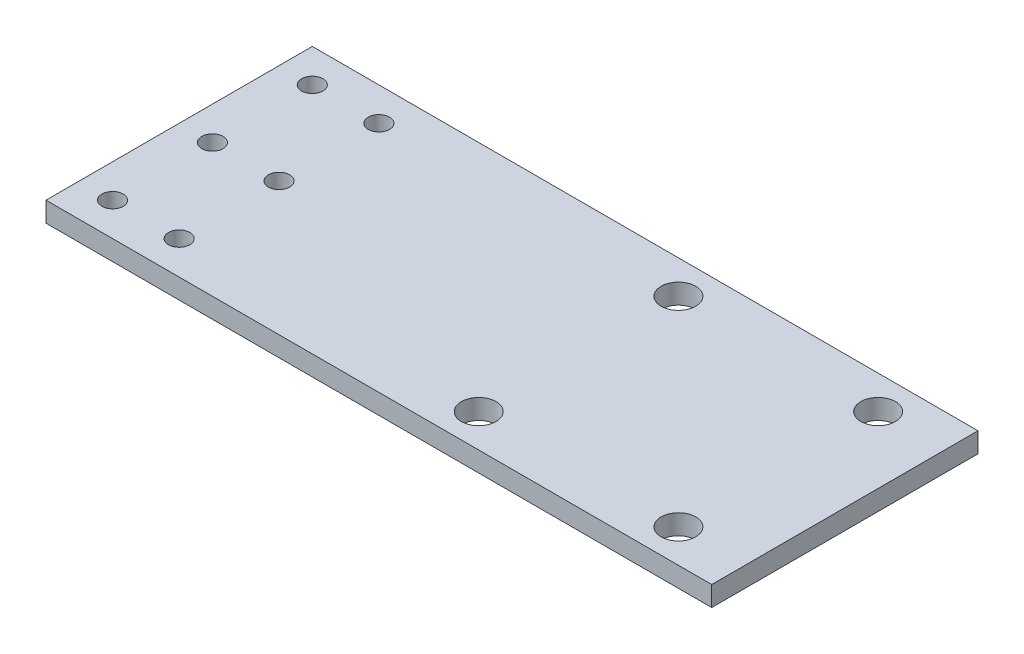
ISO-10303-21;
HEADER;
FILE_DESCRIPTION(('STEP AP214'),'2;1');
FILE_NAME('part.step','',(''),(''),'','','');
FILE_SCHEMA(('AUTOMOTIVE_DESIGN { 1 0 10303 214 1 1 1 1 }'));
ENDSEC;
DATA;
#1=APPLICATION_CONTEXT('core data for automotive mechanical design processes');
#2=APPLICATION_PROTOCOL_DEFINITION('international standard','automotive_design',2000,#1);
#3=PRODUCT_CONTEXT('',#1,'mechanical');
#4=PRODUCT('Part','Part','',(#3));
#5=PRODUCT_RELATED_PRODUCT_CATEGORY('part','',(#4));
#6=PRODUCT_DEFINITION_FORMATION('','',#4);
#7=PRODUCT_DEFINITION_CONTEXT('part definition',#1,'design');
#8=PRODUCT_DEFINITION('design','',#6,#7);
#9=PRODUCT_DEFINITION_SHAPE('','',#8);
#10=(LENGTH_UNIT() NAMED_UNIT(*) SI_UNIT(.MILLI.,.METRE.));
#11=(NAMED_UNIT(*) PLANE_ANGLE_UNIT() SI_UNIT($,.RADIAN.));
#12=(NAMED_UNIT(*) SI_UNIT($,.STERADIAN.) SOLID_ANGLE_UNIT());
#13=UNCERTAINTY_MEASURE_WITH_UNIT(LENGTH_MEASURE(1.E-05),#10,'distance_accuracy_value','');
#14=(GEOMETRIC_REPRESENTATION_CONTEXT(3) GLOBAL_UNCERTAINTY_ASSIGNED_CONTEXT((#13)) GLOBAL_UNIT_ASSIGNED_CONTEXT((#10,
#11,#12)) REPRESENTATION_CONTEXT('',''));
#15=CARTESIAN_POINT('',(0.,0.,0.));
#16=DIRECTION('',(0.,0.,1.));
#17=DIRECTION('',(1.,0.,0.));
#18=AXIS2_PLACEMENT_3D('',#15,#16,#17);
#19=CARTESIAN_POINT('',(0.,3.,0.));
#20=DIRECTION('',(0.,1.,0.));
#21=DIRECTION('',(0.,0.,1.));
#22=AXIS2_PLACEMENT_3D('',#19,#20,#21);
#23=PLANE('',#22);
#24=CARTESIAN_POINT('',(90.,3.,5.));
#25=DIRECTION('',(0.,1.,0.));
#26=DIRECTION('',(0.,0.,-1.));
#27=AXIS2_PLACEMENT_3D('',#24,#25,#26);
#28=CIRCLE('',#27,2.59999999999999);
#29=CARTESIAN_POINT('',(90.,3.,2.40000000000001));
#30=VERTEX_POINT('',#29);
#31=EDGE_CURVE('E165',#30,#30,#28,.T.);
#32=ORIENTED_EDGE('',*,*,#31,.F.);
#33=EDGE_LOOP('',(#32));
#34=FACE_BOUND('',#33,.T.);
#35=CARTESIAN_POINT('',(90.,3.,35.));
#36=DIRECTION('',(0.,1.,0.));
#37=DIRECTION('',(0.,0.,1.));
#38=AXIS2_PLACEMENT_3D('',#35,#36,#37);
#39=CIRCLE('',#38,2.59999999999999);
#40=CARTESIAN_POINT('',(90.,3.,37.6));
#41=VERTEX_POINT('',#40);
#42=EDGE_CURVE('E171',#41,#41,#39,.T.);
#43=ORIENTED_EDGE('',*,*,#42,.F.);
#44=EDGE_LOOP('',(#43));
#45=FACE_BOUND('',#44,.T.);
#46=CARTESIAN_POINT('',(60.,3.,35.));
#47=DIRECTION('',(0.,1.,0.));
#48=DIRECTION('',(0.,0.,-1.));
#49=AXIS2_PLACEMENT_3D('',#46,#47,#48);
#50=CIRCLE('',#49,2.59999999999999);
#51=CARTESIAN_POINT('',(60.,3.,32.4));
#52=VERTEX_POINT('',#51);
#53=EDGE_CURVE('E159',#52,#52,#50,.T.);
#54=ORIENTED_EDGE('',*,*,#53,.F.);
#55=EDGE_LOOP('',(#54));
#56=FACE_BOUND('',#55,.T.);
#57=CARTESIAN_POINT('',(60.,3.,5.));
#58=DIRECTION('',(0.,1.,0.));
#59=DIRECTION('',(0.,0.,1.));
#60=AXIS2_PLACEMENT_3D('',#57,#58,#59);
#61=CIRCLE('',#60,2.59999999999999);
#62=CARTESIAN_POINT('',(60.,3.,7.59999999999999));
#63=VERTEX_POINT('',#62);
#64=EDGE_CURVE('E156',#63,#63,#61,.T.);
#65=ORIENTED_EDGE('',*,*,#64,.F.);
#66=EDGE_LOOP('',(#65));
#67=FACE_BOUND('',#66,.T.);
#68=CARTESIAN_POINT('',(15.,3.,35.));
#69=DIRECTION('',(0.,1.,0.));
#70=DIRECTION('',(0.,0.,1.));
#71=AXIS2_PLACEMENT_3D('',#68,#69,#70);
#72=CIRCLE('',#71,1.6);
#73=CARTESIAN_POINT('',(15.,3.,36.6));
#74=VERTEX_POINT('',#73);
#75=EDGE_CURVE('E141',#74,#74,#72,.T.);
#76=ORIENTED_EDGE('',*,*,#75,.F.);
#77=EDGE_LOOP('',(#76));
#78=FACE_BOUND('',#77,.T.);
#79=CARTESIAN_POINT('',(15.,3.,20.));
#80=DIRECTION('',(0.,1.,0.));
#81=DIRECTION('',(0.,0.,-1.));
#82=AXIS2_PLACEMENT_3D('',#79,#80,#81);
#83=CIRCLE('',#82,1.6);
#84=CARTESIAN_POINT('',(15.,3.,18.4));
#85=VERTEX_POINT('',#84);
#86=EDGE_CURVE('E129',#85,#85,#83,.T.);
#87=ORIENTED_EDGE('',*,*,#86,.F.);
#88=EDGE_LOOP('',(#87));
#89=FACE_BOUND('',#88,.T.);
#90=CARTESIAN_POINT('',(5.,3.,20.));
#91=DIRECTION('',(0.,1.,0.));
#92=DIRECTION('',(0.,0.,1.));
#93=AXIS2_PLACEMENT_3D('',#90,#91,#92);
#94=CIRCLE('',#93,1.6);
#95=CARTESIAN_POINT('',(5.,3.,21.6));
#96=VERTEX_POINT('',#95);
#97=EDGE_CURVE('E108',#96,#96,#94,.T.);
#98=ORIENTED_EDGE('',*,*,#97,.F.);
#99=EDGE_LOOP('',(#98));
#100=FACE_BOUND('',#99,.T.);
#101=DIRECTION('',(0.,0.,1.));
#102=VECTOR('',#101,1.);
#103=CARTESIAN_POINT('',(0.,3.,0.));
#104=LINE('',#103,#102);
#105=CARTESIAN_POINT('',(0.,3.,0.));
#106=VERTEX_POINT('',#105);
#107=CARTESIAN_POINT('',(0.,3.,40.));
#108=VERTEX_POINT('',#107);
#109=EDGE_CURVE('E93',#106,#108,#104,.T.);
#110=ORIENTED_EDGE('',*,*,#109,.T.);
#111=DIRECTION('',(1.,0.,0.));
#112=VECTOR('',#111,1.);
#113=CARTESIAN_POINT('',(0.,3.,40.));
#114=LINE('',#113,#112);
#115=CARTESIAN_POINT('',(100.,3.,40.));
#116=VERTEX_POINT('',#115);
#117=EDGE_CURVE('E88',#108,#116,#114,.T.);
#118=ORIENTED_EDGE('',*,*,#117,.T.);
#119=DIRECTION('',(0.,0.,-1.));
#120=VECTOR('',#119,1.);
#121=CARTESIAN_POINT('',(100.,3.,0.));
#122=LINE('',#121,#120);
#123=CARTESIAN_POINT('',(100.,3.,0.));
#124=VERTEX_POINT('',#123);
#125=EDGE_CURVE('E91',#116,#124,#122,.T.);
#126=ORIENTED_EDGE('',*,*,#125,.T.);
#127=DIRECTION('',(-1.,0.,0.));
#128=VECTOR('',#127,1.);
#129=CARTESIAN_POINT('',(0.,3.,0.));
#130=LINE('',#129,#128);
#131=EDGE_CURVE('E58',#124,#106,#130,.T.);
#132=ORIENTED_EDGE('',*,*,#131,.T.);
#133=EDGE_LOOP('',(#110,#118,#126,#132));
#134=FACE_BOUND('',#133,.T.);
#135=CARTESIAN_POINT('',(5.,3.,5.));
#136=DIRECTION('',(0.,1.,0.));
#137=DIRECTION('',(0.,0.,1.));
#138=AXIS2_PLACEMENT_3D('',#135,#136,#137);
#139=CIRCLE('',#138,1.6);
#140=CARTESIAN_POINT('',(5.,3.,6.6));
#141=VERTEX_POINT('',#140);
#142=EDGE_CURVE('E123',#141,#141,#139,.T.);
#143=ORIENTED_EDGE('',*,*,#142,.F.);
#144=EDGE_LOOP('',(#143));
#145=FACE_BOUND('',#144,.T.);
#146=CARTESIAN_POINT('',(15.,3.,5.));
#147=DIRECTION('',(0.,1.,0.));
#148=DIRECTION('',(0.,0.,-1.));
#149=AXIS2_PLACEMENT_3D('',#146,#147,#148);
#150=CIRCLE('',#149,1.6);
#151=CARTESIAN_POINT('',(15.,3.,3.4));
#152=VERTEX_POINT('',#151);
#153=EDGE_CURVE('E135',#152,#152,#150,.T.);
#154=ORIENTED_EDGE('',*,*,#153,.F.);
#155=EDGE_LOOP('',(#154));
#156=FACE_BOUND('',#155,.T.);
#157=CARTESIAN_POINT('',(5.,3.,35.));
#158=DIRECTION('',(0.,1.,0.));
#159=DIRECTION('',(0.,0.,-1.));
#160=AXIS2_PLACEMENT_3D('',#157,#158,#159);
#161=CIRCLE('',#160,1.6);
#162=CARTESIAN_POINT('',(5.,3.,33.4));
#163=VERTEX_POINT('',#162);
#164=EDGE_CURVE('E147',#163,#163,#161,.T.);
#165=ORIENTED_EDGE('',*,*,#164,.F.);
#166=EDGE_LOOP('',(#165));
#167=FACE_BOUND('',#166,.T.);
#168=ADVANCED_FACE('F41',(#34,#45,#56,#67,#78,#89,#100,#134,#145,#156,#167),#23,.T.);
#169=CARTESIAN_POINT('',(0.,0.,0.));
#170=DIRECTION('',(0.,1.,0.));
#171=DIRECTION('',(0.,0.,1.));
#172=AXIS2_PLACEMENT_3D('',#169,#170,#171);
#173=PLANE('',#172);
#174=CARTESIAN_POINT('',(90.,0.,5.));
#175=DIRECTION('',(0.,1.,0.));
#176=DIRECTION('',(0.,0.,-1.));
#177=AXIS2_PLACEMENT_3D('',#174,#175,#176);
#178=CIRCLE('',#177,2.59999999999999);
#179=CARTESIAN_POINT('',(90.,0.,2.40000000000001));
#180=VERTEX_POINT('',#179);
#181=EDGE_CURVE('E162',#180,#180,#178,.T.);
#182=ORIENTED_EDGE('',*,*,#181,.T.);
#183=EDGE_LOOP('',(#182));
#184=FACE_BOUND('',#183,.T.);
#185=CARTESIAN_POINT('',(90.,0.,35.));
#186=DIRECTION('',(0.,1.,0.));
#187=DIRECTION('',(0.,0.,1.));
#188=AXIS2_PLACEMENT_3D('',#185,#186,#187);
#189=CIRCLE('',#188,2.59999999999999);
#190=CARTESIAN_POINT('',(90.,0.,37.6));
#191=VERTEX_POINT('',#190);
#192=EDGE_CURVE('E168',#191,#191,#189,.T.);
#193=ORIENTED_EDGE('',*,*,#192,.T.);
#194=EDGE_LOOP('',(#193));
#195=FACE_BOUND('',#194,.T.);
#196=CARTESIAN_POINT('',(60.,0.,35.));
#197=DIRECTION('',(0.,1.,0.));
#198=DIRECTION('',(0.,0.,-1.));
#199=AXIS2_PLACEMENT_3D('',#196,#197,#198);
#200=CIRCLE('',#199,2.59999999999999);
#201=CARTESIAN_POINT('',(60.,0.,32.4));
#202=VERTEX_POINT('',#201);
#203=EDGE_CURVE('E174',#202,#202,#200,.T.);
#204=ORIENTED_EDGE('',*,*,#203,.T.);
#205=EDGE_LOOP('',(#204));
#206=FACE_BOUND('',#205,.T.);
#207=CARTESIAN_POINT('',(60.,0.,5.));
#208=DIRECTION('',(0.,1.,0.));
#209=DIRECTION('',(0.,0.,1.));
#210=AXIS2_PLACEMENT_3D('',#207,#208,#209);
#211=CIRCLE('',#210,2.59999999999999);
#212=CARTESIAN_POINT('',(60.,0.,7.59999999999999));
#213=VERTEX_POINT('',#212);
#214=EDGE_CURVE('E153',#213,#213,#211,.T.);
#215=ORIENTED_EDGE('',*,*,#214,.T.);
#216=EDGE_LOOP('',(#215));
#217=FACE_BOUND('',#216,.T.);
#218=DIRECTION('',(0.,0.,1.));
#219=VECTOR('',#218,1.);
#220=CARTESIAN_POINT('',(0.,0.,0.));
#221=LINE('',#220,#219);
#222=CARTESIAN_POINT('',(0.,0.,0.));
#223=VERTEX_POINT('',#222);
#224=CARTESIAN_POINT('',(0.,0.,40.));
#225=VERTEX_POINT('',#224);
#226=EDGE_CURVE('E105',#223,#225,#221,.T.);
#227=ORIENTED_EDGE('',*,*,#226,.F.);
#228=DIRECTION('',(-1.,0.,0.));
#229=VECTOR('',#228,1.);
#230=CARTESIAN_POINT('',(0.,0.,0.));
#231=LINE('',#230,#229);
#232=CARTESIAN_POINT('',(100.,0.,0.));
#233=VERTEX_POINT('',#232);
#234=EDGE_CURVE('E81',#233,#223,#231,.T.);
#235=ORIENTED_EDGE('',*,*,#234,.F.);
#236=DIRECTION('',(0.,0.,-1.));
#237=VECTOR('',#236,1.);
#238=CARTESIAN_POINT('',(100.,0.,0.));
#239=LINE('',#238,#237);
#240=CARTESIAN_POINT('',(100.,0.,40.));
#241=VERTEX_POINT('',#240);
#242=EDGE_CURVE('E75',#241,#233,#239,.T.);
#243=ORIENTED_EDGE('',*,*,#242,.F.);
#244=DIRECTION('',(1.,0.,0.));
#245=VECTOR('',#244,1.);
#246=CARTESIAN_POINT('',(0.,0.,40.));
#247=LINE('',#246,#245);
#248=EDGE_CURVE('E97',#225,#241,#247,.T.);
#249=ORIENTED_EDGE('',*,*,#248,.F.);
#250=EDGE_LOOP('',(#227,#235,#243,#249));
#251=FACE_BOUND('',#250,.T.);
#252=CARTESIAN_POINT('',(5.,0.,20.));
#253=DIRECTION('',(0.,1.,0.));
#254=DIRECTION('',(0.,0.,1.));
#255=AXIS2_PLACEMENT_3D('',#252,#253,#254);
#256=CIRCLE('',#255,1.6);
#257=CARTESIAN_POINT('',(5.,0.,21.6));
#258=VERTEX_POINT('',#257);
#259=EDGE_CURVE('E120',#258,#258,#256,.T.);
#260=ORIENTED_EDGE('',*,*,#259,.T.);
#261=EDGE_LOOP('',(#260));
#262=FACE_BOUND('',#261,.T.);
#263=CARTESIAN_POINT('',(5.,0.,5.));
#264=DIRECTION('',(0.,1.,0.));
#265=DIRECTION('',(0.,0.,1.));
#266=AXIS2_PLACEMENT_3D('',#263,#264,#265);
#267=CIRCLE('',#266,1.6);
#268=CARTESIAN_POINT('',(5.,0.,6.6));
#269=VERTEX_POINT('',#268);
#270=EDGE_CURVE('E126',#269,#269,#267,.T.);
#271=ORIENTED_EDGE('',*,*,#270,.T.);
#272=EDGE_LOOP('',(#271));
#273=FACE_BOUND('',#272,.T.);
#274=CARTESIAN_POINT('',(15.,0.,20.));
#275=DIRECTION('',(0.,1.,0.));
#276=DIRECTION('',(0.,0.,-1.));
#277=AXIS2_PLACEMENT_3D('',#274,#275,#276);
#278=CIRCLE('',#277,1.6);
#279=CARTESIAN_POINT('',(15.,0.,18.4));
#280=VERTEX_POINT('',#279);
#281=EDGE_CURVE('E132',#280,#280,#278,.T.);
#282=ORIENTED_EDGE('',*,*,#281,.T.);
#283=EDGE_LOOP('',(#282));
#284=FACE_BOUND('',#283,.T.);
#285=CARTESIAN_POINT('',(15.,0.,5.));
#286=DIRECTION('',(0.,1.,0.));
#287=DIRECTION('',(0.,0.,-1.));
#288=AXIS2_PLACEMENT_3D('',#285,#286,#287);
#289=CIRCLE('',#288,1.6);
#290=CARTESIAN_POINT('',(15.,0.,3.4));
#291=VERTEX_POINT('',#290);
#292=EDGE_CURVE('E138',#291,#291,#289,.T.);
#293=ORIENTED_EDGE('',*,*,#292,.T.);
#294=EDGE_LOOP('',(#293));
#295=FACE_BOUND('',#294,.T.);
#296=CARTESIAN_POINT('',(15.,0.,35.));
#297=DIRECTION('',(0.,1.,0.));
#298=DIRECTION('',(0.,0.,1.));
#299=AXIS2_PLACEMENT_3D('',#296,#297,#298);
#300=CIRCLE('',#299,1.6);
#301=CARTESIAN_POINT('',(15.,0.,36.6));
#302=VERTEX_POINT('',#301);
#303=EDGE_CURVE('E144',#302,#302,#300,.T.);
#304=ORIENTED_EDGE('',*,*,#303,.T.);
#305=EDGE_LOOP('',(#304));
#306=FACE_BOUND('',#305,.T.);
#307=CARTESIAN_POINT('',(5.,0.,35.));
#308=DIRECTION('',(0.,1.,0.));
#309=DIRECTION('',(0.,0.,-1.));
#310=AXIS2_PLACEMENT_3D('',#307,#308,#309);
#311=CIRCLE('',#310,1.6);
#312=CARTESIAN_POINT('',(5.,0.,33.4));
#313=VERTEX_POINT('',#312);
#314=EDGE_CURVE('E150',#313,#313,#311,.T.);
#315=ORIENTED_EDGE('',*,*,#314,.T.);
#316=EDGE_LOOP('',(#315));
#317=FACE_BOUND('',#316,.T.);
#318=ADVANCED_FACE('F116',(#184,#195,#206,#217,#251,#262,#273,#284,#295,#306,#317),#173,.F.);
#319=CARTESIAN_POINT('',(0.,3.,0.));
#320=DIRECTION('',(1.,0.,0.));
#321=DIRECTION('',(0.,0.,-1.));
#322=AXIS2_PLACEMENT_3D('',#319,#320,#321);
#323=PLANE('',#322);
#324=ORIENTED_EDGE('',*,*,#226,.T.);
#325=DIRECTION('',(0.,-1.,0.));
#326=VECTOR('',#325,1.);
#327=CARTESIAN_POINT('',(0.,3.,40.));
#328=LINE('',#327,#326);
#329=EDGE_CURVE('E11',#108,#225,#328,.T.);
#330=ORIENTED_EDGE('',*,*,#329,.F.);
#331=ORIENTED_EDGE('',*,*,#109,.F.);
#332=DIRECTION('',(0.,-1.,0.));
#333=VECTOR('',#332,1.);
#334=CARTESIAN_POINT('',(0.,3.,0.));
#335=LINE('',#334,#333);
#336=EDGE_CURVE('E101',#106,#223,#335,.T.);
#337=ORIENTED_EDGE('',*,*,#336,.T.);
#338=EDGE_LOOP('',(#324,#330,#331,#337));
#339=FACE_BOUND('',#338,.T.);
#340=ADVANCED_FACE('F43',(#339),#323,.F.);
#341=CARTESIAN_POINT('',(0.,3.,40.));
#342=DIRECTION('',(0.,0.,-1.));
#343=DIRECTION('',(-1.,0.,0.));
#344=AXIS2_PLACEMENT_3D('',#341,#342,#343);
#345=PLANE('',#344);
#346=ORIENTED_EDGE('',*,*,#248,.T.);
#347=DIRECTION('',(0.,-1.,0.));
#348=VECTOR('',#347,1.);
#349=CARTESIAN_POINT('',(100.,3.,40.));
#350=LINE('',#349,#348);
#351=EDGE_CURVE('E50',#116,#241,#350,.T.);
#352=ORIENTED_EDGE('',*,*,#351,.F.);
#353=ORIENTED_EDGE('',*,*,#117,.F.);
#354=ORIENTED_EDGE('',*,*,#329,.T.);
#355=EDGE_LOOP('',(#346,#352,#353,#354));
#356=FACE_BOUND('',#355,.T.);
#357=ADVANCED_FACE('F96',(#356),#345,.F.);
#358=CARTESIAN_POINT('',(100.,3.,0.));
#359=DIRECTION('',(-1.,0.,0.));
#360=DIRECTION('',(0.,0.,1.));
#361=AXIS2_PLACEMENT_3D('',#358,#359,#360);
#362=PLANE('',#361);
#363=ORIENTED_EDGE('',*,*,#242,.T.);
#364=DIRECTION('',(0.,-1.,0.));
#365=VECTOR('',#364,1.);
#366=CARTESIAN_POINT('',(100.,3.,0.));
#367=LINE('',#366,#365);
#368=EDGE_CURVE('E98',#124,#233,#367,.T.);
#369=ORIENTED_EDGE('',*,*,#368,.F.);
#370=ORIENTED_EDGE('',*,*,#125,.F.);
#371=ORIENTED_EDGE('',*,*,#351,.T.);
#372=EDGE_LOOP('',(#363,#369,#370,#371));
#373=FACE_BOUND('',#372,.T.);
#374=ADVANCED_FACE('F99',(#373),#362,.F.);
#375=CARTESIAN_POINT('',(0.,3.,0.));
#376=DIRECTION('',(0.,0.,1.));
#377=DIRECTION('',(1.,0.,0.));
#378=AXIS2_PLACEMENT_3D('',#375,#376,#377);
#379=PLANE('',#378);
#380=ORIENTED_EDGE('',*,*,#234,.T.);
#381=ORIENTED_EDGE('',*,*,#336,.F.);
#382=ORIENTED_EDGE('',*,*,#131,.F.);
#383=ORIENTED_EDGE('',*,*,#368,.T.);
#384=EDGE_LOOP('',(#380,#381,#382,#383));
#385=FACE_BOUND('',#384,.T.);
#386=ADVANCED_FACE('F113',(#385),#379,.F.);
#387=CARTESIAN_POINT('',(5.,3.,20.));
#388=DIRECTION('',(0.,-1.,0.));
#389=DIRECTION('',(0.,0.,-1.));
#390=AXIS2_PLACEMENT_3D('',#387,#388,#389);
#391=CYLINDRICAL_SURFACE('',#390,1.6);
#392=ORIENTED_EDGE('',*,*,#97,.T.);
#393=EDGE_LOOP('',(#392));
#394=FACE_BOUND('',#393,.T.);
#395=ORIENTED_EDGE('',*,*,#259,.F.);
#396=EDGE_LOOP('',(#395));
#397=FACE_BOUND('',#396,.T.);
#398=ADVANCED_FACE('F194',(#394,#397),#391,.F.);
#399=CARTESIAN_POINT('',(5.,3.,5.));
#400=DIRECTION('',(0.,-1.,0.));
#401=DIRECTION('',(0.,0.,-1.));
#402=AXIS2_PLACEMENT_3D('',#399,#400,#401);
#403=CYLINDRICAL_SURFACE('',#402,1.6);
#404=ORIENTED_EDGE('',*,*,#142,.T.);
#405=EDGE_LOOP('',(#404));
#406=FACE_BOUND('',#405,.T.);
#407=ORIENTED_EDGE('',*,*,#270,.F.);
#408=EDGE_LOOP('',(#407));
#409=FACE_BOUND('',#408,.T.);
#410=ADVANCED_FACE('F197',(#406,#409),#403,.F.);
#411=CARTESIAN_POINT('',(15.,3.,20.));
#412=DIRECTION('',(0.,-1.,0.));
#413=DIRECTION('',(0.,0.,-1.));
#414=AXIS2_PLACEMENT_3D('',#411,#412,#413);
#415=CYLINDRICAL_SURFACE('',#414,1.6);
#416=ORIENTED_EDGE('',*,*,#86,.T.);
#417=EDGE_LOOP('',(#416));
#418=FACE_BOUND('',#417,.T.);
#419=ORIENTED_EDGE('',*,*,#281,.F.);
#420=EDGE_LOOP('',(#419));
#421=FACE_BOUND('',#420,.T.);
#422=ADVANCED_FACE('F233',(#418,#421),#415,.F.);
#423=CARTESIAN_POINT('',(15.,3.,5.));
#424=DIRECTION('',(0.,-1.,0.));
#425=DIRECTION('',(0.,0.,-1.));
#426=AXIS2_PLACEMENT_3D('',#423,#424,#425);
#427=CYLINDRICAL_SURFACE('',#426,1.6);
#428=ORIENTED_EDGE('',*,*,#153,.T.);
#429=EDGE_LOOP('',(#428));
#430=FACE_BOUND('',#429,.T.);
#431=ORIENTED_EDGE('',*,*,#292,.F.);
#432=EDGE_LOOP('',(#431));
#433=FACE_BOUND('',#432,.T.);
#434=ADVANCED_FACE('F226',(#430,#433),#427,.F.);
#435=CARTESIAN_POINT('',(15.,3.,35.));
#436=DIRECTION('',(0.,-1.,0.));
#437=DIRECTION('',(0.,0.,-1.));
#438=AXIS2_PLACEMENT_3D('',#435,#436,#437);
#439=CYLINDRICAL_SURFACE('',#438,1.6);
#440=ORIENTED_EDGE('',*,*,#75,.T.);
#441=EDGE_LOOP('',(#440));
#442=FACE_BOUND('',#441,.T.);
#443=ORIENTED_EDGE('',*,*,#303,.F.);
#444=EDGE_LOOP('',(#443));
#445=FACE_BOUND('',#444,.T.);
#446=ADVANCED_FACE('F217',(#442,#445),#439,.F.);
#447=CARTESIAN_POINT('',(5.,3.,35.));
#448=DIRECTION('',(0.,-1.,0.));
#449=DIRECTION('',(0.,0.,-1.));
#450=AXIS2_PLACEMENT_3D('',#447,#448,#449);
#451=CYLINDRICAL_SURFACE('',#450,1.6);
#452=ORIENTED_EDGE('',*,*,#164,.T.);
#453=EDGE_LOOP('',(#452));
#454=FACE_BOUND('',#453,.T.);
#455=ORIENTED_EDGE('',*,*,#314,.F.);
#456=EDGE_LOOP('',(#455));
#457=FACE_BOUND('',#456,.T.);
#458=ADVANCED_FACE('F214',(#454,#457),#451,.F.);
#459=CARTESIAN_POINT('',(60.,0.,5.));
#460=DIRECTION('',(0.,1.,0.));
#461=DIRECTION('',(0.,0.,1.));
#462=AXIS2_PLACEMENT_3D('',#459,#460,#461);
#463=CYLINDRICAL_SURFACE('',#462,2.59999999999999);
#464=ORIENTED_EDGE('',*,*,#214,.F.);
#465=EDGE_LOOP('',(#464));
#466=FACE_BOUND('',#465,.T.);
#467=ORIENTED_EDGE('',*,*,#64,.T.);
#468=EDGE_LOOP('',(#467));
#469=FACE_BOUND('',#468,.T.);
#470=ADVANCED_FACE('F216',(#466,#469),#463,.F.);
#471=CARTESIAN_POINT('',(60.,0.,35.));
#472=DIRECTION('',(0.,1.,0.));
#473=DIRECTION('',(0.,0.,1.));
#474=AXIS2_PLACEMENT_3D('',#471,#472,#473);
#475=CYLINDRICAL_SURFACE('',#474,2.59999999999999);
#476=ORIENTED_EDGE('',*,*,#203,.F.);
#477=EDGE_LOOP('',(#476));
#478=FACE_BOUND('',#477,.T.);
#479=ORIENTED_EDGE('',*,*,#53,.T.);
#480=EDGE_LOOP('',(#479));
#481=FACE_BOUND('',#480,.T.);
#482=ADVANCED_FACE('F180',(#478,#481),#475,.F.);
#483=CARTESIAN_POINT('',(90.,0.,35.));
#484=DIRECTION('',(0.,1.,0.));
#485=DIRECTION('',(0.,0.,1.));
#486=AXIS2_PLACEMENT_3D('',#483,#484,#485);
#487=CYLINDRICAL_SURFACE('',#486,2.59999999999999);
#488=ORIENTED_EDGE('',*,*,#192,.F.);
#489=EDGE_LOOP('',(#488));
#490=FACE_BOUND('',#489,.T.);
#491=ORIENTED_EDGE('',*,*,#42,.T.);
#492=EDGE_LOOP('',(#491));
#493=FACE_BOUND('',#492,.T.);
#494=ADVANCED_FACE('F321',(#490,#493),#487,.F.);
#495=CARTESIAN_POINT('',(90.,0.,5.));
#496=DIRECTION('',(0.,1.,0.));
#497=DIRECTION('',(0.,0.,1.));
#498=AXIS2_PLACEMENT_3D('',#495,#496,#497);
#499=CYLINDRICAL_SURFACE('',#498,2.59999999999999);
#500=ORIENTED_EDGE('',*,*,#181,.F.);
#501=EDGE_LOOP('',(#500));
#502=FACE_BOUND('',#501,.T.);
#503=ORIENTED_EDGE('',*,*,#31,.T.);
#504=EDGE_LOOP('',(#503));
#505=FACE_BOUND('',#504,.T.);
#506=ADVANCED_FACE('F331',(#502,#505),#499,.F.);
#507=CLOSED_SHELL('',(#168,#318,#340,#357,#374,#386,#398,#410,#422,#434,#446,#458,#470,#482,
#494,#506));
#508=MANIFOLD_SOLID_BREP('B2',#507);
#509=ADVANCED_BREP_SHAPE_REPRESENTATION('',(#18,#508),#14);
#510=SHAPE_DEFINITION_REPRESENTATION(#9,#509);
ENDSEC;
END-ISO-10303-21;
